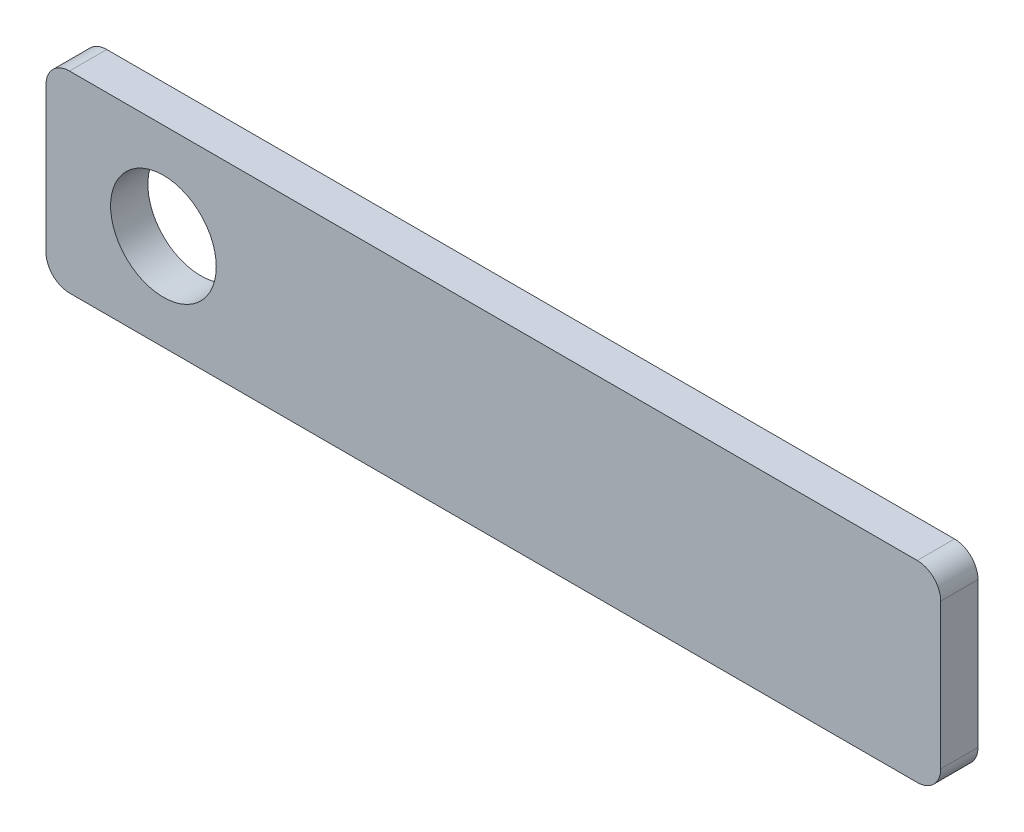
ISO-10303-21;
HEADER;
FILE_DESCRIPTION(('STEP AP214'),'2;1');
FILE_NAME('part.step','',(''),(''),'','','');
FILE_SCHEMA(('AUTOMOTIVE_DESIGN { 1 0 10303 214 1 1 1 1 }'));
ENDSEC;
DATA;
#1=APPLICATION_CONTEXT('core data for automotive mechanical design processes');
#2=APPLICATION_PROTOCOL_DEFINITION('international standard','automotive_design',2000,#1);
#3=PRODUCT_CONTEXT('',#1,'mechanical');
#4=PRODUCT('Part','Part','',(#3));
#5=PRODUCT_RELATED_PRODUCT_CATEGORY('part','',(#4));
#6=PRODUCT_DEFINITION_FORMATION('','',#4);
#7=PRODUCT_DEFINITION_CONTEXT('part definition',#1,'design');
#8=PRODUCT_DEFINITION('design','',#6,#7);
#9=PRODUCT_DEFINITION_SHAPE('','',#8);
#10=(LENGTH_UNIT() NAMED_UNIT(*) SI_UNIT(.MILLI.,.METRE.));
#11=(NAMED_UNIT(*) PLANE_ANGLE_UNIT() SI_UNIT($,.RADIAN.));
#12=(NAMED_UNIT(*) SI_UNIT($,.STERADIAN.) SOLID_ANGLE_UNIT());
#13=UNCERTAINTY_MEASURE_WITH_UNIT(LENGTH_MEASURE(1.E-05),#10,'distance_accuracy_value','');
#14=(GEOMETRIC_REPRESENTATION_CONTEXT(3) GLOBAL_UNCERTAINTY_ASSIGNED_CONTEXT((#13)) GLOBAL_UNIT_ASSIGNED_CONTEXT((#10,
#11,#12)) REPRESENTATION_CONTEXT('',''));
#15=CARTESIAN_POINT('',(0.,0.,0.));
#16=DIRECTION('',(0.,0.,1.));
#17=DIRECTION('',(1.,0.,0.));
#18=AXIS2_PLACEMENT_3D('',#15,#16,#17);
#19=CARTESIAN_POINT('',(0.,0.,3.175));
#20=DIRECTION('',(1.,0.,0.));
#21=DIRECTION('',(0.,1.,0.));
#22=AXIS2_PLACEMENT_3D('',#19,#20,#21);
#23=PLANE('',#22);
#24=DIRECTION('',(0.,-1.,0.));
#25=VECTOR('',#24,1.);
#26=CARTESIAN_POINT('',(0.,0.,0.));
#27=LINE('',#26,#25);
#28=CARTESIAN_POINT('',(0.,-2.,0.));
#29=VERTEX_POINT('',#28);
#30=CARTESIAN_POINT('',(0.,-14.378,0.));
#31=VERTEX_POINT('',#30);
#32=EDGE_CURVE('E157',#29,#31,#27,.T.);
#33=ORIENTED_EDGE('',*,*,#32,.T.);
#34=DIRECTION('',(0.,0.,-1.));
#35=VECTOR('',#34,1.);
#36=CARTESIAN_POINT('',(0.,-14.378,3.175));
#37=LINE('',#36,#35);
#38=CARTESIAN_POINT('',(0.,-14.378,3.175));
#39=VERTEX_POINT('',#38);
#40=EDGE_CURVE('E11',#31,#39,#37,.F.);
#41=ORIENTED_EDGE('',*,*,#40,.T.);
#42=DIRECTION('',(0.,-1.,0.));
#43=VECTOR('',#42,1.);
#44=CARTESIAN_POINT('',(0.,0.,3.175));
#45=LINE('',#44,#43);
#46=CARTESIAN_POINT('',(0.,-2.,3.175));
#47=VERTEX_POINT('',#46);
#48=EDGE_CURVE('E125',#47,#39,#45,.T.);
#49=ORIENTED_EDGE('',*,*,#48,.F.);
#50=DIRECTION('',(0.,0.,-1.));
#51=VECTOR('',#50,1.);
#52=CARTESIAN_POINT('',(0.,-2.,3.175));
#53=LINE('',#52,#51);
#54=EDGE_CURVE('E41',#47,#29,#53,.T.);
#55=ORIENTED_EDGE('',*,*,#54,.T.);
#56=EDGE_LOOP('',(#33,#41,#49,#55));
#57=FACE_BOUND('',#56,.T.);
#58=ADVANCED_FACE('F33',(#57),#23,.F.);
#59=CARTESIAN_POINT('',(0.,-16.378,3.175));
#60=DIRECTION('',(0.,1.,0.));
#61=DIRECTION('',(0.,0.,1.));
#62=AXIS2_PLACEMENT_3D('',#59,#60,#61);
#63=PLANE('',#62);
#64=DIRECTION('',(1.,0.,0.));
#65=VECTOR('',#64,1.);
#66=CARTESIAN_POINT('',(0.,-16.378,0.));
#67=LINE('',#66,#65);
#68=CARTESIAN_POINT('',(2.,-16.378,0.));
#69=VERTEX_POINT('',#68);
#70=CARTESIAN_POINT('',(74.2,-16.378,0.));
#71=VERTEX_POINT('',#70);
#72=EDGE_CURVE('E130',#69,#71,#67,.T.);
#73=ORIENTED_EDGE('',*,*,#72,.T.);
#74=DIRECTION('',(0.,0.,-1.));
#75=VECTOR('',#74,1.);
#76=CARTESIAN_POINT('',(74.2,-16.378,3.175));
#77=LINE('',#76,#75);
#78=CARTESIAN_POINT('',(74.2,-16.378,3.175));
#79=VERTEX_POINT('',#78);
#80=EDGE_CURVE('E48',#71,#79,#77,.F.);
#81=ORIENTED_EDGE('',*,*,#80,.T.);
#82=DIRECTION('',(1.,0.,0.));
#83=VECTOR('',#82,1.);
#84=CARTESIAN_POINT('',(0.,-16.378,3.175));
#85=LINE('',#84,#83);
#86=CARTESIAN_POINT('',(2.,-16.378,3.175));
#87=VERTEX_POINT('',#86);
#88=EDGE_CURVE('E128',#87,#79,#85,.T.);
#89=ORIENTED_EDGE('',*,*,#88,.F.);
#90=DIRECTION('',(0.,0.,-1.));
#91=VECTOR('',#90,1.);
#92=CARTESIAN_POINT('',(2.,-16.378,3.175));
#93=LINE('',#92,#91);
#94=EDGE_CURVE('E149',#87,#69,#93,.T.);
#95=ORIENTED_EDGE('',*,*,#94,.T.);
#96=EDGE_LOOP('',(#73,#81,#89,#95));
#97=FACE_BOUND('',#96,.T.);
#98=ADVANCED_FACE('F188',(#97),#63,.F.);
#99=CARTESIAN_POINT('',(76.2,0.,3.175));
#100=DIRECTION('',(-1.,0.,0.));
#101=DIRECTION('',(0.,-1.,0.));
#102=AXIS2_PLACEMENT_3D('',#99,#100,#101);
#103=PLANE('',#102);
#104=DIRECTION('',(0.,1.,0.));
#105=VECTOR('',#104,1.);
#106=CARTESIAN_POINT('',(76.2,0.,0.));
#107=LINE('',#106,#105);
#108=CARTESIAN_POINT('',(76.2,-14.378,0.));
#109=VERTEX_POINT('',#108);
#110=CARTESIAN_POINT('',(76.2,-2.,0.));
#111=VERTEX_POINT('',#110);
#112=EDGE_CURVE('E126',#109,#111,#107,.T.);
#113=ORIENTED_EDGE('',*,*,#112,.T.);
#114=DIRECTION('',(0.,0.,-1.));
#115=VECTOR('',#114,1.);
#116=CARTESIAN_POINT('',(76.2,-2.,3.175));
#117=LINE('',#116,#115);
#118=CARTESIAN_POINT('',(76.2,-2.,3.175));
#119=VERTEX_POINT('',#118);
#120=EDGE_CURVE('E104',#111,#119,#117,.F.);
#121=ORIENTED_EDGE('',*,*,#120,.T.);
#122=DIRECTION('',(0.,1.,0.));
#123=VECTOR('',#122,1.);
#124=CARTESIAN_POINT('',(76.2,0.,3.175));
#125=LINE('',#124,#123);
#126=CARTESIAN_POINT('',(76.2,-14.378,3.175));
#127=VERTEX_POINT('',#126);
#128=EDGE_CURVE('E169',#127,#119,#125,.T.);
#129=ORIENTED_EDGE('',*,*,#128,.F.);
#130=DIRECTION('',(0.,0.,-1.));
#131=VECTOR('',#130,1.);
#132=CARTESIAN_POINT('',(76.2,-14.378,3.175));
#133=LINE('',#132,#131);
#134=EDGE_CURVE('E109',#127,#109,#133,.T.);
#135=ORIENTED_EDGE('',*,*,#134,.T.);
#136=EDGE_LOOP('',(#113,#121,#129,#135));
#137=FACE_BOUND('',#136,.T.);
#138=ADVANCED_FACE('F185',(#137),#103,.F.);
#139=CARTESIAN_POINT('',(0.,0.,3.175));
#140=DIRECTION('',(0.,-1.,0.));
#141=DIRECTION('',(0.,0.,-1.));
#142=AXIS2_PLACEMENT_3D('',#139,#140,#141);
#143=PLANE('',#142);
#144=DIRECTION('',(-1.,0.,0.));
#145=VECTOR('',#144,1.);
#146=CARTESIAN_POINT('',(0.,0.,3.175));
#147=LINE('',#146,#145);
#148=CARTESIAN_POINT('',(74.2,0.,3.175));
#149=VERTEX_POINT('',#148);
#150=CARTESIAN_POINT('',(2.,0.,3.175));
#151=VERTEX_POINT('',#150);
#152=EDGE_CURVE('E119',#149,#151,#147,.T.);
#153=ORIENTED_EDGE('',*,*,#152,.F.);
#154=DIRECTION('',(0.,0.,-1.));
#155=VECTOR('',#154,1.);
#156=CARTESIAN_POINT('',(74.2,0.,3.175));
#157=LINE('',#156,#155);
#158=CARTESIAN_POINT('',(74.2,0.,0.));
#159=VERTEX_POINT('',#158);
#160=EDGE_CURVE('E103',#149,#159,#157,.T.);
#161=ORIENTED_EDGE('',*,*,#160,.T.);
#162=DIRECTION('',(-1.,0.,0.));
#163=VECTOR('',#162,1.);
#164=CARTESIAN_POINT('',(0.,0.,0.));
#165=LINE('',#164,#163);
#166=CARTESIAN_POINT('',(2.,0.,0.));
#167=VERTEX_POINT('',#166);
#168=EDGE_CURVE('E116',#159,#167,#165,.T.);
#169=ORIENTED_EDGE('',*,*,#168,.T.);
#170=DIRECTION('',(0.,0.,-1.));
#171=VECTOR('',#170,1.);
#172=CARTESIAN_POINT('',(2.,0.,3.175));
#173=LINE('',#172,#171);
#174=EDGE_CURVE('E121',#167,#151,#173,.F.);
#175=ORIENTED_EDGE('',*,*,#174,.T.);
#176=EDGE_LOOP('',(#153,#161,#169,#175));
#177=FACE_BOUND('',#176,.T.);
#178=ADVANCED_FACE('F115',(#177),#143,.F.);
#179=CARTESIAN_POINT('',(0.,0.,3.175));
#180=DIRECTION('',(0.,0.,1.));
#181=DIRECTION('',(1.,0.,0.));
#182=AXIS2_PLACEMENT_3D('',#179,#180,#181);
#183=PLANE('',#182);
#184=CARTESIAN_POINT('',(10.,-8.189,3.175));
#185=DIRECTION('',(0.,0.,1.));
#186=DIRECTION('',(1.,0.,0.));
#187=AXIS2_PLACEMENT_3D('',#184,#185,#186);
#188=CIRCLE('',#187,4.5);
#189=CARTESIAN_POINT('',(14.5,-8.189,3.175));
#190=VERTEX_POINT('',#189);
#191=EDGE_CURVE('E165',#190,#190,#188,.T.);
#192=ORIENTED_EDGE('',*,*,#191,.F.);
#193=EDGE_LOOP('',(#192));
#194=FACE_BOUND('',#193,.T.);
#195=ORIENTED_EDGE('',*,*,#128,.T.);
#196=CARTESIAN_POINT('',(74.2,-2.,3.175));
#197=DIRECTION('',(0.,0.,1.));
#198=DIRECTION('',(1.,0.,0.));
#199=AXIS2_PLACEMENT_3D('',#196,#197,#198);
#200=CIRCLE('',#199,2.);
#201=EDGE_CURVE('E147',#119,#149,#200,.T.);
#202=ORIENTED_EDGE('',*,*,#201,.T.);
#203=ORIENTED_EDGE('',*,*,#152,.T.);
#204=CARTESIAN_POINT('',(2.,-2.,3.175));
#205=DIRECTION('',(0.,0.,1.));
#206=DIRECTION('',(1.,0.,0.));
#207=AXIS2_PLACEMENT_3D('',#204,#205,#206);
#208=CIRCLE('',#207,2.);
#209=EDGE_CURVE('E142',#151,#47,#208,.T.);
#210=ORIENTED_EDGE('',*,*,#209,.T.);
#211=ORIENTED_EDGE('',*,*,#48,.T.);
#212=CARTESIAN_POINT('',(2.,-14.378,3.175));
#213=DIRECTION('',(0.,0.,1.));
#214=DIRECTION('',(1.,0.,0.));
#215=AXIS2_PLACEMENT_3D('',#212,#213,#214);
#216=CIRCLE('',#215,2.);
#217=EDGE_CURVE('E55',#39,#87,#216,.T.);
#218=ORIENTED_EDGE('',*,*,#217,.T.);
#219=ORIENTED_EDGE('',*,*,#88,.T.);
#220=CARTESIAN_POINT('',(74.2,-14.378,3.175));
#221=DIRECTION('',(0.,0.,1.));
#222=DIRECTION('',(1.,0.,0.));
#223=AXIS2_PLACEMENT_3D('',#220,#221,#222);
#224=CIRCLE('',#223,2.);
#225=EDGE_CURVE('E145',#79,#127,#224,.T.);
#226=ORIENTED_EDGE('',*,*,#225,.T.);
#227=EDGE_LOOP('',(#195,#202,#203,#210,#211,#218,#219,#226));
#228=FACE_BOUND('',#227,.T.);
#229=ADVANCED_FACE('F178',(#194,#228),#183,.T.);
#230=CARTESIAN_POINT('',(0.,0.,0.));
#231=DIRECTION('',(0.,0.,1.));
#232=DIRECTION('',(1.,0.,0.));
#233=AXIS2_PLACEMENT_3D('',#230,#231,#232);
#234=PLANE('',#233);
#235=CARTESIAN_POINT('',(10.,-8.189,0.));
#236=DIRECTION('',(0.,0.,1.));
#237=DIRECTION('',(1.,0.,0.));
#238=AXIS2_PLACEMENT_3D('',#235,#236,#237);
#239=CIRCLE('',#238,4.5);
#240=CARTESIAN_POINT('',(14.5,-8.189,0.));
#241=VERTEX_POINT('',#240);
#242=EDGE_CURVE('E162',#241,#241,#239,.T.);
#243=ORIENTED_EDGE('',*,*,#242,.T.);
#244=EDGE_LOOP('',(#243));
#245=FACE_BOUND('',#244,.T.);
#246=ORIENTED_EDGE('',*,*,#168,.F.);
#247=CARTESIAN_POINT('',(74.2,-2.,0.));
#248=DIRECTION('',(0.,0.,1.));
#249=DIRECTION('',(1.,0.,0.));
#250=AXIS2_PLACEMENT_3D('',#247,#248,#249);
#251=CIRCLE('',#250,2.);
#252=EDGE_CURVE('E99',#159,#111,#251,.F.);
#253=ORIENTED_EDGE('',*,*,#252,.T.);
#254=ORIENTED_EDGE('',*,*,#112,.F.);
#255=CARTESIAN_POINT('',(74.2,-14.378,0.));
#256=DIRECTION('',(0.,0.,1.));
#257=DIRECTION('',(1.,0.,0.));
#258=AXIS2_PLACEMENT_3D('',#255,#256,#257);
#259=CIRCLE('',#258,2.);
#260=EDGE_CURVE('E110',#109,#71,#259,.F.);
#261=ORIENTED_EDGE('',*,*,#260,.T.);
#262=ORIENTED_EDGE('',*,*,#72,.F.);
#263=CARTESIAN_POINT('',(2.,-14.378,0.));
#264=DIRECTION('',(0.,0.,1.));
#265=DIRECTION('',(1.,0.,0.));
#266=AXIS2_PLACEMENT_3D('',#263,#264,#265);
#267=CIRCLE('',#266,2.);
#268=EDGE_CURVE('E136',#69,#31,#267,.F.);
#269=ORIENTED_EDGE('',*,*,#268,.T.);
#270=ORIENTED_EDGE('',*,*,#32,.F.);
#271=CARTESIAN_POINT('',(2.,-2.,0.));
#272=DIRECTION('',(0.,0.,1.));
#273=DIRECTION('',(1.,0.,0.));
#274=AXIS2_PLACEMENT_3D('',#271,#272,#273);
#275=CIRCLE('',#274,2.);
#276=EDGE_CURVE('E120',#29,#167,#275,.F.);
#277=ORIENTED_EDGE('',*,*,#276,.T.);
#278=EDGE_LOOP('',(#246,#253,#254,#261,#262,#269,#270,#277));
#279=FACE_BOUND('',#278,.T.);
#280=ADVANCED_FACE('F123',(#245,#279),#234,.F.);
#281=CARTESIAN_POINT('',(74.2,-2.,3.175));
#282=DIRECTION('',(0.,0.,-1.));
#283=DIRECTION('',(-1.,0.,0.));
#284=AXIS2_PLACEMENT_3D('',#281,#282,#283);
#285=CYLINDRICAL_SURFACE('',#284,2.);
#286=ORIENTED_EDGE('',*,*,#201,.F.);
#287=ORIENTED_EDGE('',*,*,#120,.F.);
#288=ORIENTED_EDGE('',*,*,#252,.F.);
#289=ORIENTED_EDGE('',*,*,#160,.F.);
#290=EDGE_LOOP('',(#286,#287,#288,#289));
#291=FACE_BOUND('',#290,.T.);
#292=ADVANCED_FACE('F102',(#291),#285,.T.);
#293=CARTESIAN_POINT('',(74.2,-14.378,3.175));
#294=DIRECTION('',(0.,0.,-1.));
#295=DIRECTION('',(-1.,0.,0.));
#296=AXIS2_PLACEMENT_3D('',#293,#294,#295);
#297=CYLINDRICAL_SURFACE('',#296,2.);
#298=ORIENTED_EDGE('',*,*,#225,.F.);
#299=ORIENTED_EDGE('',*,*,#80,.F.);
#300=ORIENTED_EDGE('',*,*,#260,.F.);
#301=ORIENTED_EDGE('',*,*,#134,.F.);
#302=EDGE_LOOP('',(#298,#299,#300,#301));
#303=FACE_BOUND('',#302,.T.);
#304=ADVANCED_FACE('F187',(#303),#297,.T.);
#305=CARTESIAN_POINT('',(2.,-14.378,3.175));
#306=DIRECTION('',(0.,0.,-1.));
#307=DIRECTION('',(-1.,0.,0.));
#308=AXIS2_PLACEMENT_3D('',#305,#306,#307);
#309=CYLINDRICAL_SURFACE('',#308,2.);
#310=ORIENTED_EDGE('',*,*,#217,.F.);
#311=ORIENTED_EDGE('',*,*,#40,.F.);
#312=ORIENTED_EDGE('',*,*,#268,.F.);
#313=ORIENTED_EDGE('',*,*,#94,.F.);
#314=EDGE_LOOP('',(#310,#311,#312,#313));
#315=FACE_BOUND('',#314,.T.);
#316=ADVANCED_FACE('F191',(#315),#309,.T.);
#317=CARTESIAN_POINT('',(2.,-2.,3.175));
#318=DIRECTION('',(0.,0.,-1.));
#319=DIRECTION('',(-1.,0.,0.));
#320=AXIS2_PLACEMENT_3D('',#317,#318,#319);
#321=CYLINDRICAL_SURFACE('',#320,2.);
#322=ORIENTED_EDGE('',*,*,#209,.F.);
#323=ORIENTED_EDGE('',*,*,#174,.F.);
#324=ORIENTED_EDGE('',*,*,#276,.F.);
#325=ORIENTED_EDGE('',*,*,#54,.F.);
#326=EDGE_LOOP('',(#322,#323,#324,#325));
#327=FACE_BOUND('',#326,.T.);
#328=ADVANCED_FACE('F35',(#327),#321,.T.);
#329=CARTESIAN_POINT('',(10.,-8.189,3.175));
#330=DIRECTION('',(0.,0.,1.));
#331=DIRECTION('',(1.,0.,0.));
#332=AXIS2_PLACEMENT_3D('',#329,#330,#331);
#333=CYLINDRICAL_SURFACE('',#332,4.5);
#334=ORIENTED_EDGE('',*,*,#242,.F.);
#335=EDGE_LOOP('',(#334));
#336=FACE_BOUND('',#335,.T.);
#337=ORIENTED_EDGE('',*,*,#191,.T.);
#338=EDGE_LOOP('',(#337));
#339=FACE_BOUND('',#338,.T.);
#340=ADVANCED_FACE('F176',(#336,#339),#333,.F.);
#341=CLOSED_SHELL('',(#58,#98,#138,#178,#229,#280,#292,#304,#316,#328,#340));
#342=MANIFOLD_SOLID_BREP('B2',#341);
#343=ADVANCED_BREP_SHAPE_REPRESENTATION('',(#18,#342),#14);
#344=SHAPE_DEFINITION_REPRESENTATION(#9,#343);
ENDSEC;
END-ISO-10303-21;
